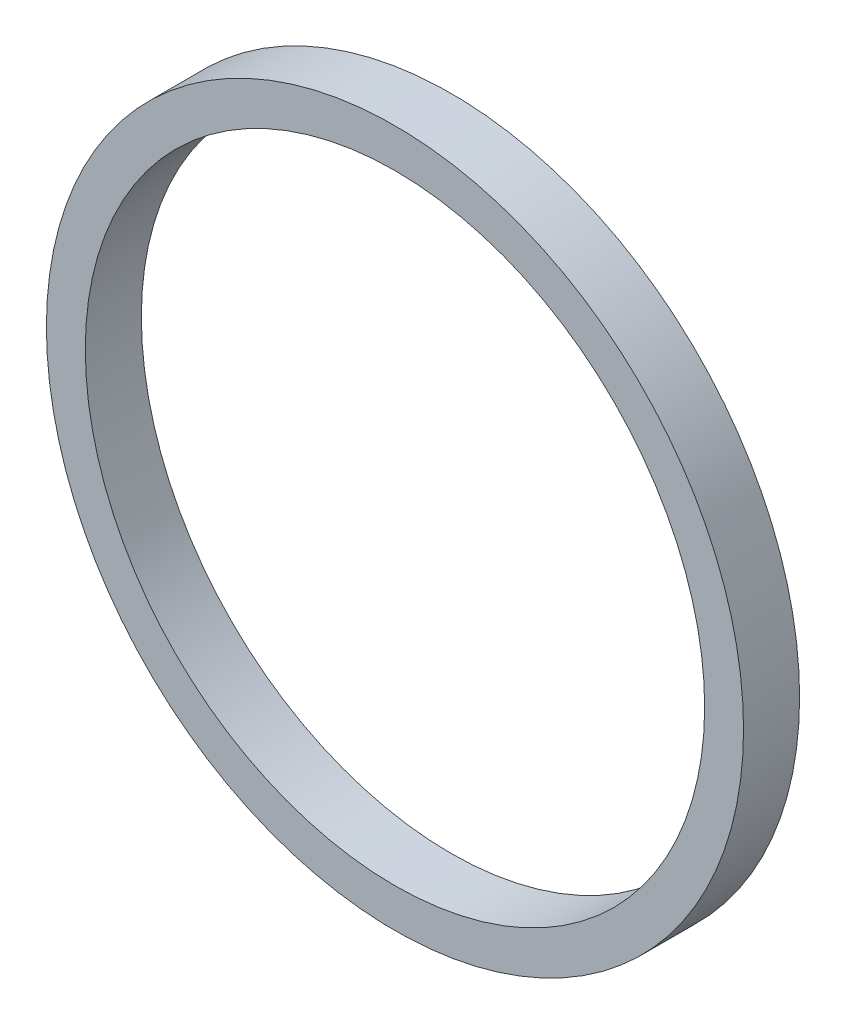
ISO-10303-21;
HEADER;
FILE_DESCRIPTION(('STEP AP214'),'2;1');
FILE_NAME('part.step','',(''),(''),'','','');
FILE_SCHEMA(('AUTOMOTIVE_DESIGN { 1 0 10303 214 1 1 1 1 }'));
ENDSEC;
DATA;
#1=APPLICATION_CONTEXT('core data for automotive mechanical design processes');
#2=APPLICATION_PROTOCOL_DEFINITION('international standard','automotive_design',2000,#1);
#3=PRODUCT_CONTEXT('',#1,'mechanical');
#4=PRODUCT('Part','Part','',(#3));
#5=PRODUCT_RELATED_PRODUCT_CATEGORY('part','',(#4));
#6=PRODUCT_DEFINITION_FORMATION('','',#4);
#7=PRODUCT_DEFINITION_CONTEXT('part definition',#1,'design');
#8=PRODUCT_DEFINITION('design','',#6,#7);
#9=PRODUCT_DEFINITION_SHAPE('','',#8);
#10=(LENGTH_UNIT() NAMED_UNIT(*) SI_UNIT(.MILLI.,.METRE.));
#11=(NAMED_UNIT(*) PLANE_ANGLE_UNIT() SI_UNIT($,.RADIAN.));
#12=(NAMED_UNIT(*) SI_UNIT($,.STERADIAN.) SOLID_ANGLE_UNIT());
#13=UNCERTAINTY_MEASURE_WITH_UNIT(LENGTH_MEASURE(1.E-05),#10,'distance_accuracy_value','');
#14=(GEOMETRIC_REPRESENTATION_CONTEXT(3) GLOBAL_UNCERTAINTY_ASSIGNED_CONTEXT((#13)) GLOBAL_UNIT_ASSIGNED_CONTEXT((#10,
#11,#12)) REPRESENTATION_CONTEXT('',''));
#15=CARTESIAN_POINT('',(0.,0.,0.));
#16=DIRECTION('',(0.,0.,1.));
#17=DIRECTION('',(1.,0.,0.));
#18=AXIS2_PLACEMENT_3D('',#15,#16,#17);
#19=CARTESIAN_POINT('',(0.,0.,4.));
#20=DIRECTION('',(0.,0.,1.));
#21=DIRECTION('',(1.,0.,0.));
#22=AXIS2_PLACEMENT_3D('',#19,#20,#21);
#23=PLANE('',#22);
#24=CARTESIAN_POINT('',(0.,0.,4.));
#25=DIRECTION('',(0.,0.,1.));
#26=DIRECTION('',(1.,0.,0.));
#27=AXIS2_PLACEMENT_3D('',#24,#25,#26);
#28=CIRCLE('',#27,24.875);
#29=CARTESIAN_POINT('',(24.875,0.,4.));
#30=VERTEX_POINT('',#29);
#31=EDGE_CURVE('E10',#30,#30,#28,.T.);
#32=ORIENTED_EDGE('',*,*,#31,.T.);
#33=EDGE_LOOP('',(#32));
#34=FACE_BOUND('',#33,.T.);
#35=CARTESIAN_POINT('',(0.,0.,4.));
#36=DIRECTION('',(0.,0.,1.));
#37=DIRECTION('',(1.,0.,0.));
#38=AXIS2_PLACEMENT_3D('',#35,#36,#37);
#39=CIRCLE('',#38,22.1);
#40=CARTESIAN_POINT('',(22.1,0.,4.));
#41=VERTEX_POINT('',#40);
#42=EDGE_CURVE('E50',#41,#41,#39,.T.);
#43=ORIENTED_EDGE('',*,*,#42,.F.);
#44=EDGE_LOOP('',(#43));
#45=FACE_BOUND('',#44,.T.);
#46=ADVANCED_FACE('F37',(#34,#45),#23,.T.);
#47=CARTESIAN_POINT('',(0.,0.,0.));
#48=DIRECTION('',(0.,0.,1.));
#49=DIRECTION('',(1.,0.,0.));
#50=AXIS2_PLACEMENT_3D('',#47,#48,#49);
#51=PLANE('',#50);
#52=CARTESIAN_POINT('',(0.,0.,0.));
#53=DIRECTION('',(0.,0.,1.));
#54=DIRECTION('',(1.,0.,0.));
#55=AXIS2_PLACEMENT_3D('',#52,#53,#54);
#56=CIRCLE('',#55,24.875);
#57=CARTESIAN_POINT('',(24.875,0.,0.));
#58=VERTEX_POINT('',#57);
#59=EDGE_CURVE('E41',#58,#58,#56,.T.);
#60=ORIENTED_EDGE('',*,*,#59,.F.);
#61=EDGE_LOOP('',(#60));
#62=FACE_BOUND('',#61,.T.);
#63=CARTESIAN_POINT('',(0.,0.,0.));
#64=DIRECTION('',(0.,0.,1.));
#65=DIRECTION('',(1.,0.,0.));
#66=AXIS2_PLACEMENT_3D('',#63,#64,#65);
#67=CIRCLE('',#66,22.1);
#68=CARTESIAN_POINT('',(22.1,0.,0.));
#69=VERTEX_POINT('',#68);
#70=EDGE_CURVE('E52',#69,#69,#67,.T.);
#71=ORIENTED_EDGE('',*,*,#70,.T.);
#72=EDGE_LOOP('',(#71));
#73=FACE_BOUND('',#72,.T.);
#74=ADVANCED_FACE('F64',(#62,#73),#51,.F.);
#75=CARTESIAN_POINT('',(0.,0.,4.));
#76=DIRECTION('',(0.,0.,-1.));
#77=DIRECTION('',(-1.,0.,0.));
#78=AXIS2_PLACEMENT_3D('',#75,#76,#77);
#79=CYLINDRICAL_SURFACE('',#78,24.875);
#80=ORIENTED_EDGE('',*,*,#31,.F.);
#81=EDGE_LOOP('',(#80));
#82=FACE_BOUND('',#81,.T.);
#83=ORIENTED_EDGE('',*,*,#59,.T.);
#84=EDGE_LOOP('',(#83));
#85=FACE_BOUND('',#84,.T.);
#86=ADVANCED_FACE('F39',(#82,#85),#79,.T.);
#87=CARTESIAN_POINT('',(0.,0.,4.));
#88=DIRECTION('',(0.,0.,-1.));
#89=DIRECTION('',(-1.,0.,0.));
#90=AXIS2_PLACEMENT_3D('',#87,#88,#89);
#91=CYLINDRICAL_SURFACE('',#90,22.1);
#92=ORIENTED_EDGE('',*,*,#42,.T.);
#93=EDGE_LOOP('',(#92));
#94=FACE_BOUND('',#93,.T.);
#95=ORIENTED_EDGE('',*,*,#70,.F.);
#96=EDGE_LOOP('',(#95));
#97=FACE_BOUND('',#96,.T.);
#98=ADVANCED_FACE('F60',(#94,#97),#91,.F.);
#99=CLOSED_SHELL('',(#46,#74,#86,#98));
#100=MANIFOLD_SOLID_BREP('B2',#99);
#101=ADVANCED_BREP_SHAPE_REPRESENTATION('',(#18,#100),#14);
#102=SHAPE_DEFINITION_REPRESENTATION(#9,#101);
ENDSEC;
END-ISO-10303-21;
